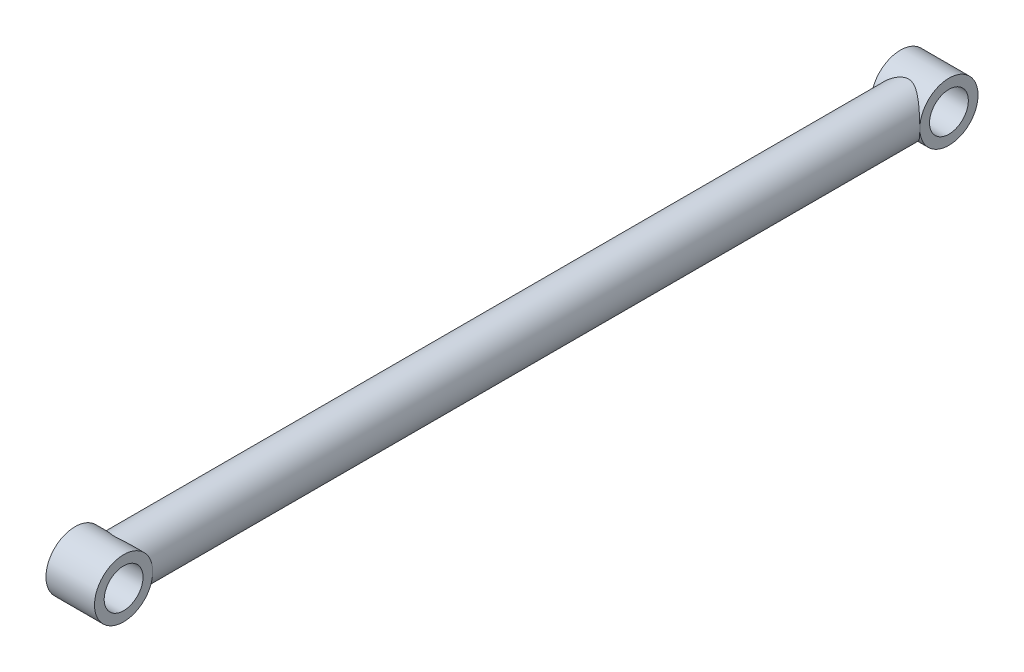
ISO-10303-21;
HEADER;
FILE_DESCRIPTION(('STEP AP214'),'2;1');
FILE_NAME('part.step','',(''),(''),'','','');
FILE_SCHEMA(('AUTOMOTIVE_DESIGN { 1 0 10303 214 1 1 1 1 }'));
ENDSEC;
DATA;
#1=APPLICATION_CONTEXT('core data for automotive mechanical design processes');
#2=APPLICATION_PROTOCOL_DEFINITION('international standard','automotive_design',2000,#1);
#3=PRODUCT_CONTEXT('',#1,'mechanical');
#4=PRODUCT('Part','Part','',(#3));
#5=PRODUCT_RELATED_PRODUCT_CATEGORY('part','',(#4));
#6=PRODUCT_DEFINITION_FORMATION('','',#4);
#7=PRODUCT_DEFINITION_CONTEXT('part definition',#1,'design');
#8=PRODUCT_DEFINITION('design','',#6,#7);
#9=PRODUCT_DEFINITION_SHAPE('','',#8);
#10=(LENGTH_UNIT() NAMED_UNIT(*) SI_UNIT(.MILLI.,.METRE.));
#11=(NAMED_UNIT(*) PLANE_ANGLE_UNIT() SI_UNIT($,.RADIAN.));
#12=(NAMED_UNIT(*) SI_UNIT($,.STERADIAN.) SOLID_ANGLE_UNIT());
#13=UNCERTAINTY_MEASURE_WITH_UNIT(LENGTH_MEASURE(1.E-05),#10,'distance_accuracy_value','');
#14=(GEOMETRIC_REPRESENTATION_CONTEXT(3) GLOBAL_UNCERTAINTY_ASSIGNED_CONTEXT((#13)) GLOBAL_UNIT_ASSIGNED_CONTEXT((#10,
#11,#12)) REPRESENTATION_CONTEXT('',''));
#15=CARTESIAN_POINT('',(0.,0.,0.));
#16=DIRECTION('',(0.,0.,1.));
#17=DIRECTION('',(1.,0.,0.));
#18=AXIS2_PLACEMENT_3D('',#15,#16,#17);
#19=CARTESIAN_POINT('',(0.,0.,170.));
#20=DIRECTION('',(0.,0.,-1.));
#21=DIRECTION('',(-1.,0.,0.));
#22=AXIS2_PLACEMENT_3D('',#19,#20,#21);
#23=CYLINDRICAL_SURFACE('',#22,5.);
#24=CARTESIAN_POINT('',(-5.,0.,164.));
#25=CARTESIAN_POINT('',(-5.0000064862677,-0.118803401095404,163.999993637204));
#26=CARTESIAN_POINT('',(-4.99576243276274,-0.237558182871218,164.003532436608));
#27=CARTESIAN_POINT('',(-4.97888342242901,-0.474087838067091,164.01758781878));
#28=CARTESIAN_POINT('',(-4.96624750352265,-0.591862597565707,164.028105201601));
#29=CARTESIAN_POINT('',(-4.93280067838579,-0.825474733693951,164.055890647865));
#30=CARTESIAN_POINT('',(-4.9119867768663,-0.941311384241479,164.073161184726));
#31=CARTESIAN_POINT('',(-4.86255145148515,-1.17018155731566,164.114066169517));
#32=CARTESIAN_POINT('',(-4.83392655878944,-1.28321381003105,164.137703444833));
#33=CARTESIAN_POINT('',(-4.73740362240781,-1.61550772291657,164.21712549774));
#34=CARTESIAN_POINT('',(-4.65860789353559,-1.82964493287682,164.281630481709));
#35=CARTESIAN_POINT('',(-4.47594785576945,-2.23973970904934,164.429432068903));
#36=CARTESIAN_POINT('',(-4.37207507698348,-2.4356911018925,164.512735020608));
#37=CARTESIAN_POINT('',(-4.17931765246547,-2.74874935510359,164.664796967453));
#38=CARTESIAN_POINT('',(-4.09605321766379,-2.87121824175386,164.729845481327));
#39=CARTESIAN_POINT('',(-3.92057491487891,-3.10654667374617,164.865043917853));
#40=CARTESIAN_POINT('',(-3.82836116355909,-3.21940634431805,164.935193773999));
#41=CARTESIAN_POINT('',(-3.63553308278676,-3.43568816068561,165.079330910766));
#42=CARTESIAN_POINT('',(-3.53489678957744,-3.53908406033976,165.153328021096));
#43=CARTESIAN_POINT('',(-3.3260070437939,-3.73607907111507,165.303506811469));
#44=CARTESIAN_POINT('',(-3.21775455132495,-3.8296794133862,165.379688215443));
#45=CARTESIAN_POINT('',(-2.99186847524312,-4.00872533168447,165.534090593809));
#46=CARTESIAN_POINT('',(-2.87409893732902,-4.09398918746845,165.612323305427));
#47=CARTESIAN_POINT('',(-2.63097870098597,-4.25431125048951,165.767590859531));
#48=CARTESIAN_POINT('',(-2.50562548412934,-4.32936604026973,165.844625293293));
#49=CARTESIAN_POINT('',(-2.24746866950543,-4.46882104937818,165.994988438694));
#50=CARTESIAN_POINT('',(-2.1146836425388,-4.53324636625594,166.068325587028));
#51=CARTESIAN_POINT('',(-1.84110422364289,-4.65107409789266,166.208445967709));
#52=CARTESIAN_POINT('',(-1.70031678782895,-4.7044859047621,166.275234758659));
#53=CARTESIAN_POINT('',(-1.39667622874441,-4.8038705578035,166.404163695034));
#54=CARTESIAN_POINT('',(-1.2329915636929,-4.8486776643058,166.465282103806));
#55=CARTESIAN_POINT('',(-0.89618081181772,-4.92202476595886,166.568128085754));
#56=CARTESIAN_POINT('',(-0.723078773763452,-4.95060424437363,166.609902678024));
#57=CARTESIAN_POINT('',(-0.457661896369328,-4.97982440219376,166.653115686237));
#58=CARTESIAN_POINT('',(-0.367618679010208,-4.98729261982801,166.6642863));
#59=CARTESIAN_POINT('',(-0.186635888055972,-4.99733565959028,166.679348465274));
#60=CARTESIAN_POINT('',(-0.095696399075085,-4.99991093928053,166.683240697421));
#61=CARTESIAN_POINT('',(0.0861953552894909,-5.00008454722765,166.683502917529));
#62=CARTESIAN_POINT('',(0.177147620700291,-4.99768286475912,166.679872889279));
#63=CARTESIAN_POINT('',(0.358199787378105,-4.98797701095386,166.665309542838));
#64=CARTESIAN_POINT('',(0.448299583463606,-4.9806722424497,166.65437533504));
#65=CARTESIAN_POINT('',(0.634290345987509,-4.9605577711742,166.624616752253));
#66=CARTESIAN_POINT('',(0.730044329719754,-4.94734291419499,166.605214847078));
#67=CARTESIAN_POINT('',(0.919072038911205,-4.91574053984291,166.559612529394));
#68=CARTESIAN_POINT('',(1.01234395824115,-4.89734936269664,166.533407307809));
#69=CARTESIAN_POINT('',(1.28826795172827,-4.83487145070514,166.446256557005));
#70=CARTESIAN_POINT('',(1.46664526370661,-4.78352415648849,166.376845736021));
#71=CARTESIAN_POINT('',(1.77568076874673,-4.67632227850058,166.239951281895));
#72=CARTESIAN_POINT('',(1.90862269999416,-4.62355194613135,166.174992042876));
#73=CARTESIAN_POINT('',(2.16730339944133,-4.50808681272014,166.039561687936));
#74=CARTESIAN_POINT('',(2.29303788433661,-4.44538619181529,165.969087352102));
#75=CARTESIAN_POINT('',(2.53766285158915,-4.31043075762213,165.825081209764));
#76=CARTESIAN_POINT('',(2.65654383781023,-4.23816312441516,165.751545393107));
#77=CARTESIAN_POINT('',(2.887435642852,-4.08435401417141,165.603472913388));
#78=CARTESIAN_POINT('',(2.99944783455585,-4.00281439970956,165.528936453981));
#79=CARTESIAN_POINT('',(3.22226109628925,-3.82600354374309,165.376579223159));
#80=CARTESIAN_POINT('',(3.33269201981384,-3.73023700414127,165.298790707347));
#81=CARTESIAN_POINT('',(3.54559939981482,-3.52848927170204,165.145535959127));
#82=CARTESIAN_POINT('',(3.64807467199061,-3.42250656330088,165.070070073477));
#83=CARTESIAN_POINT('',(3.84425294796646,-3.20056123189976,164.923183546337));
#84=CARTESIAN_POINT('',(3.93797365950208,-3.08461970676721,164.851754859816));
#85=CARTESIAN_POINT('',(4.11599426421232,-2.84274064052499,164.714338905396));
#86=CARTESIAN_POINT('',(4.20029381312781,-2.71680273442451,164.648351836362));
#87=CARTESIAN_POINT('',(4.39878554184215,-2.38827463214807,164.491466854075));
#88=CARTESIAN_POINT('',(4.50631929530223,-2.17932731194457,164.40501053214));
#89=CARTESIAN_POINT('',(4.6461382191431,-1.85137170360815,164.291596129459));
#90=CARTESIAN_POINT('',(4.68917312218693,-1.73959798407551,164.256495593987));
#91=CARTESIAN_POINT('',(4.76751793421715,-1.5117085668639,164.192357028335));
#92=CARTESIAN_POINT('',(4.80283171060455,-1.39559507719873,164.163315963388));
#93=CARTESIAN_POINT('',(4.86543453319275,-1.15874024023436,164.111694818951));
#94=CARTESIAN_POINT('',(4.89265476556203,-1.03796855116848,164.089170185509));
#95=CARTESIAN_POINT('',(4.93816722227971,-0.793680719841994,164.051442774801));
#96=CARTESIAN_POINT('',(4.95646386645159,-0.670165967971763,164.036236372888));
#97=CARTESIAN_POINT('',(4.98377697031546,-0.421443909131326,164.013517273965));
#98=CARTESIAN_POINT('',(4.99279601788868,-0.296237084023963,164.006002431483));
#99=CARTESIAN_POINT('',(5.00137053830483,-0.0452813606588042,163.99885833827));
#100=CARTESIAN_POINT('',(5.00092704086014,0.0804674771283417,163.999228229523));
#101=CARTESIAN_POINT('',(4.9912131909085,0.316217699577943,164.007320807918));
#102=CARTESIAN_POINT('',(4.98300958868131,0.426296149457778,164.014154882391));
#103=CARTESIAN_POINT('',(4.95942180024423,0.645178571447215,164.033776596911));
#104=CARTESIAN_POINT('',(4.94403538382096,0.753982136950611,164.046566086069));
#105=CARTESIAN_POINT('',(4.90632392627915,0.969508932578306,164.077846411027));
#106=CARTESIAN_POINT('',(4.88400108118508,1.07623280976892,164.096335442378));
#107=CARTESIAN_POINT('',(4.83274114539644,1.28701083316508,164.138670741227));
#108=CARTESIAN_POINT('',(4.80380153552006,1.39106394571239,164.162519049088));
#109=CARTESIAN_POINT('',(4.70677908129299,1.7010035720486,164.242190020335));
#110=CARTESIAN_POINT('',(4.62897463511254,1.9019731799027,164.305734510938));
#111=CARTESIAN_POINT('',(4.45119251532423,2.28736622034059,164.449291701797));
#112=CARTESIAN_POINT('',(4.3512066453561,2.47178350112437,164.529310488757));
#113=CARTESIAN_POINT('',(4.1624130336276,2.77431022087583,164.678035970102));
#114=CARTESIAN_POINT('',(4.0780788136314,2.89671891082119,164.74381246034));
#115=CARTESIAN_POINT('',(3.90043631108397,3.13182124456798,164.880412696568));
#116=CARTESIAN_POINT('',(3.80712768883633,3.24451452031801,164.951236633586));
#117=CARTESIAN_POINT('',(3.61204642318577,3.46039828484838,165.096670900892));
#118=CARTESIAN_POINT('',(3.51024916115615,3.56355916557856,165.171291981155));
#119=CARTESIAN_POINT('',(3.29899388009153,3.75997885952871,165.322615719837));
#120=CARTESIAN_POINT('',(3.18953694443029,3.85323906840844,165.399318082945));
#121=CARTESIAN_POINT('',(2.96121350414881,4.03144708201685,165.554592788302));
#122=CARTESIAN_POINT('',(2.84221365304655,4.11621624228696,165.633174029159));
#123=CARTESIAN_POINT('',(2.59654816531051,4.27543853436323,165.788939860809));
#124=CARTESIAN_POINT('',(2.46987979366079,4.34988795406826,165.866123940397));
#125=CARTESIAN_POINT('',(2.20902653418027,4.48797579821674,166.016477189005));
#126=CARTESIAN_POINT('',(2.07486275313431,4.5516427283941,166.089656586787));
#127=CARTESIAN_POINT('',(1.79841659242439,4.66777738062596,166.22904841427));
#128=CARTESIAN_POINT('',(1.65614180525616,4.72025536508446,166.295267199669));
#129=CARTESIAN_POINT('',(1.35146946258289,4.81674752553352,166.421491086304));
#130=CARTESIAN_POINT('',(1.18836978046231,4.85976816309607,166.480594639897));
#131=CARTESIAN_POINT('',(0.853057506761652,4.92964324178356,166.579129868936));
#132=CARTESIAN_POINT('',(0.68086885802008,4.95653805629937,166.618610630155));
#133=CARTESIAN_POINT('',(0.417267118823478,4.98335884043903,166.658388143927));
#134=CARTESIAN_POINT('',(0.327939885729427,4.99004397434119,166.668407002933));
#135=CARTESIAN_POINT('',(0.148522532584006,4.99859875462369,166.681253423056));
#136=CARTESIAN_POINT('',(0.0584324772193321,5.00046880529626,166.68408158793));
#137=CARTESIAN_POINT('',(-0.121644228189346,4.99933140644564,166.682367649082));
#138=CARTESIAN_POINT('',(-0.211630875727247,4.99632384110741,166.677825370354));
#139=CARTESIAN_POINT('',(-0.390705731690877,4.98551920595954,166.661633404506));
#140=CARTESIAN_POINT('',(-0.47979344453758,4.97771962684742,166.649979993715));
#141=CARTESIAN_POINT('',(-0.665670000297157,4.95646386284238,166.618601030407));
#142=CARTESIAN_POINT('',(-0.762277582327873,4.94249693749092,166.598152480986));
#143=CARTESIAN_POINT('',(-0.952897655384488,4.90931375512976,166.550437000639));
#144=CARTESIAN_POINT('',(-1.04690820177153,4.89009367595846,166.523165106317));
#145=CARTESIAN_POINT('',(-1.32490519247795,4.8250289352981,166.432849622302));
#146=CARTESIAN_POINT('',(-1.50447425917302,4.77182601328661,166.361379650538));
#147=CARTESIAN_POINT('',(-1.81560530153221,4.66101333620417,166.220942915864));
#148=CARTESIAN_POINT('',(-1.94948557461553,4.60651894445037,166.154442116726));
#149=CARTESIAN_POINT('',(-2.20989471783674,4.48741065580203,166.016097847012));
#150=CARTESIAN_POINT('',(-2.33641925480238,4.42279087534719,165.944251283));
#151=CARTESIAN_POINT('',(-2.58247503937633,4.28378589016394,165.797690769041));
#152=CARTESIAN_POINT('',(-2.70199665984658,4.2093876779387,165.722973095249));
#153=CARTESIAN_POINT('',(-2.93399936330049,4.05109347216154,165.572749153453));
#154=CARTESIAN_POINT('',(-3.04648185894273,3.96719939385693,165.497243047249));
#155=CARTESIAN_POINT('',(-3.26970299172238,3.78559728592267,165.343380537841));
#156=CARTESIAN_POINT('',(-3.38008420704462,3.68741297206348,165.265066438866));
#157=CARTESIAN_POINT('',(-3.59266286414684,3.48062708656682,165.111046523001));
#158=CARTESIAN_POINT('',(-3.69485901563594,3.37202387840549,165.035341118412));
#159=CARTESIAN_POINT('',(-3.89018127821449,3.14465963115808,164.88830854053));
#160=CARTESIAN_POINT('',(-3.98332637820856,3.02592088507476,164.816972322433));
#161=CARTESIAN_POINT('',(-4.15984718243074,2.77827797167412,164.680110195279));
#162=CARTESIAN_POINT('',(-4.24322187964866,2.64937275881195,164.614584885306));
#163=CARTESIAN_POINT('',(-4.43658392581481,2.3171577550576,164.461199242977));
#164=CARTESIAN_POINT('',(-4.54010823809405,2.10785901335221,164.377736073906));
#165=CARTESIAN_POINT('',(-4.67390583373133,1.78004652854708,164.268967142579));
#166=CARTESIAN_POINT('',(-4.71491832045553,1.66848545194822,164.235452843433));
#167=CARTESIAN_POINT('',(-4.78927419077672,1.44122911865495,164.174479197701));
#168=CARTESIAN_POINT('',(-4.82261863938527,1.32553443865751,164.147019010283));
#169=CARTESIAN_POINT('',(-4.90034346391482,1.01333234603968,164.082855108749));
#170=CARTESIAN_POINT('',(-4.93754678243695,0.813745597053287,164.05195986098));
#171=CARTESIAN_POINT('',(-4.98736819813601,0.409390797411419,164.010538835449));
#172=CARTESIAN_POINT('',(-4.99998882825426,0.20462328277229,164.000010959083));
#173=CARTESIAN_POINT('',(-5.,0.,164.));
#174=B_SPLINE_CURVE_WITH_KNOTS('',3,(#24,#25,#26,#27,#28,#29,#30,#31,#32,#33,#34,#35,#36,#37,
#38,#39,#40,#41,#42,#43,#44,#45,#46,#47,#48,#49,#50,#51,#52,#53,#54,#55,#56,#57,#58,#59,#60,#61,
#62,#63,#64,#65,#66,#67,#68,#69,#70,#71,#72,#73,#74,#75,#76,#77,#78,#79,#80,#81,#82,#83,#84,#85,
#86,#87,#88,#89,#90,#91,#92,#93,#94,#95,#96,#97,#98,#99,#100,#101,#102,#103,#104,#105,#106,#107,
#108,#109,#110,#111,#112,#113,#114,#115,#116,#117,#118,#119,#120,#121,#122,#123,#124,#125,#126,
#127,#128,#129,#130,#131,#132,#133,#134,#135,#136,#137,#138,#139,#140,#141,#142,#143,#144,#145,
#146,#147,#148,#149,#150,#151,#152,#153,#154,#155,#156,#157,#158,#159,#160,#161,#162,#163,#164,
#165,#166,#167,#168,#169,#170,#171,#172,#173),.UNSPECIFIED.,.T.,.F.,(4,2,2,2,2,2,2,2,2,2,2,2,2,
2,2,2,2,2,2,2,2,2,2,2,2,2,2,2,2,2,2,2,2,2,2,2,2,2,2,2,2,2,2,2,2,2,2,2,2,2,2,2,2,2,2,2,2,2,2,2,2,
2,2,2,2,2,2,2,2,2,2,2,2,2,4),(0.,0.356198531128417,0.712437905356866,1.06880787854775,
1.42533637270188,2.13333209783896,2.84156728725027,3.32622201622343,3.81087042808176,
4.29682459639559,4.78271761425371,5.27755036039958,5.77254834493269,6.26636031071475,
6.75974940543411,7.2993625527848,7.83765708456691,8.11040822806102,8.38313386402393,
8.65586008771503,8.92861953390791,9.2239270185622,9.51944381892723,10.1116379066241,
10.5823769120489,11.0533928323054,11.5250464324406,11.9966054526408,12.4928422896337,
12.9891528567513,13.4844367603639,13.979738756255,14.7274446962692,15.10150349884,
15.4753745093336,15.8523389140401,16.2291164194432,16.6057887984766,16.9824201883012,
17.3138076935884,17.6452981608743,17.9766837873554,18.3081957920452,18.9794342536,
19.6509211619365,20.1379627282135,20.6250227371036,21.1135480143902,21.6020043344423,
22.0992028034934,22.5965796576366,23.0926203414621,23.5882040850606,24.1228614856737,
24.6561746412,24.9262177314021,25.1962381470459,25.4662649741991,25.7364333195518,
26.0351569724179,26.3340985560113,26.9331443359532,27.4099325615983,27.8869988690867,
28.3647063284081,28.8423176087131,29.3434029116173,29.8445670506109,30.3446559675371,
30.844796382089,31.5852621624667,31.9553671316833,32.3254206660409,32.9389891607903,
33.5524944315665),.UNSPECIFIED.);
#175=CARTESIAN_POINT('',(-5.,0.,164.));
#176=VERTEX_POINT('',#175);
#177=CARTESIAN_POINT('',(5.00000000000002,0.,164.));
#178=VERTEX_POINT('',#177);
#179=EDGE_CURVE('E75',#176,#178,#174,.T.);
#180=ORIENTED_EDGE('',*,*,#179,.F.);
#181=EDGE_CURVE('E61',#178,#176,#174,.T.);
#182=ORIENTED_EDGE('',*,*,#181,.F.);
#183=EDGE_LOOP('',(#180,#182));
#184=FACE_BOUND('',#183,.T.);
#185=CARTESIAN_POINT('',(5.,0.,6.));
#186=CARTESIAN_POINT('',(5.00002798627288,-0.119348935079419,6.00002919850301));
#187=CARTESIAN_POINT('',(4.99572803553543,-0.23867958036178,5.99644020652463));
#188=CARTESIAN_POINT('',(4.97868412788821,-0.476234476230305,5.98224494804962));
#189=CARTESIAN_POINT('',(4.96594611312676,-0.594459446069387,5.97164361970086));
#190=CARTESIAN_POINT('',(4.93236700382239,-0.828002477996366,5.94374988935124));
#191=CARTESIAN_POINT('',(4.91158897146557,-0.943335902346165,5.9265095655111));
#192=CARTESIAN_POINT('',(4.86229105276058,-1.17120170011539,5.8857184515863));
#193=CARTESIAN_POINT('',(4.83377018032473,-1.28373371476774,5.86216685773619));
#194=CARTESIAN_POINT('',(4.76951835736753,-1.50496658686726,5.80930051949784));
#195=CARTESIAN_POINT('',(4.73380779812543,-1.61367728038003,5.78000208014341));
#196=CARTESIAN_POINT('',(4.65562143123109,-1.82705211318845,5.71614428529929));
#197=CARTESIAN_POINT('',(4.61314316805229,-1.93171476653797,5.68158302050031));
#198=CARTESIAN_POINT('',(4.47616272504167,-2.23926573906388,5.57073812162035));
#199=CARTESIAN_POINT('',(4.3721770693891,-2.43550744867541,5.48734511252619));
#200=CARTESIAN_POINT('',(4.17930372356553,-2.7487842906501,5.33519226752433));
#201=CARTESIAN_POINT('',(4.09603750264319,-2.87124496412886,5.2701422858056));
#202=CARTESIAN_POINT('',(3.92054441805434,-3.10658192431559,5.13493271106889));
#203=CARTESIAN_POINT('',(3.82831737859482,-3.2194580229123,5.06477301781555));
#204=CARTESIAN_POINT('',(3.63548337755196,-3.43574133365567,4.92063241630692));
#205=CARTESIAN_POINT('',(3.53485619448337,-3.53912436048791,4.84664246009394));
#206=CARTESIAN_POINT('',(3.32598578779926,-3.7360970997034,4.69647824059821));
#207=CARTESIAN_POINT('',(3.21774353082589,-3.82968805133515,4.62030425527637));
#208=CARTESIAN_POINT('',(2.99186761360954,-4.00872611376803,4.46590881347895));
#209=CARTESIAN_POINT('',(2.87409722305524,-4.0939904560112,4.3876755543847));
#210=CARTESIAN_POINT('',(2.6309750881559,-4.25431349476038,4.23240687859203));
#211=CARTESIAN_POINT('',(2.50562082230674,-4.32936876969041,4.15537187111191));
#212=CARTESIAN_POINT('',(2.24746373773334,-4.46882350281307,4.00500880900492));
#213=CARTESIAN_POINT('',(2.114679606144,-4.53324821588881,3.93167226471335));
#214=CARTESIAN_POINT('',(1.84110210714595,-4.65107489837774,3.7915530290794));
#215=CARTESIAN_POINT('',(1.70031569672374,-4.70448626106774,3.72476477842125));
#216=CARTESIAN_POINT('',(1.39667699983213,-4.80387030632006,3.59583663196801));
#217=CARTESIAN_POINT('',(1.23299315747397,-4.84867722860129,3.53471849082027));
#218=CARTESIAN_POINT('',(0.896182495864177,-4.92202448714337,3.43187232185616));
#219=CARTESIAN_POINT('',(0.723079629981996,-4.95060414994846,3.39009746162937));
#220=CARTESIAN_POINT('',(0.457661938224444,-4.97982439766832,3.34688432045088));
#221=CARTESIAN_POINT('',(0.367618763795172,-4.98729261281735,3.33571371048368));
#222=CARTESIAN_POINT('',(0.186636059098122,-4.99733565239978,3.32065154554476));
#223=CARTESIAN_POINT('',(0.095696613445123,-4.99991093439811,3.316759309933));
#224=CARTESIAN_POINT('',(-0.0861951407917185,-5.00008455170297,3.31649707573075));
#225=CARTESIAN_POINT('',(-0.177147449414514,-4.99768287160056,3.32012710042958));
#226=CARTESIAN_POINT('',(-0.358199702166334,-4.98797701786367,3.33469044681948));
#227=CARTESIAN_POINT('',(-0.448299541111552,-4.98067224704856,3.34562465813616));
#228=CARTESIAN_POINT('',(-0.634291003932044,-4.9605576999989,3.3753833530699));
#229=CARTESIAN_POINT('',(-0.730045633205449,-4.94734273423708,3.39478541722633));
#230=CARTESIAN_POINT('',(-0.919074596107933,-4.91574007429052,3.44038813776632));
#231=CARTESIAN_POINT('',(-1.0123471235597,-4.89734872024239,3.46659360333995));
#232=CARTESIAN_POINT('',(-1.28827037830915,-4.83487075242421,3.55374438737304));
#233=CARTESIAN_POINT('',(-1.46664643390008,-4.783523750858,3.62315478197574));
#234=CARTESIAN_POINT('',(-1.77567908944062,-4.67632286079959,3.76004797450957));
#235=CARTESIAN_POINT('',(-1.90861943875745,-4.62355324007214,3.82500636461011));
#236=CARTESIAN_POINT('',(-2.1672971701239,-4.50808975490199,3.96043493597843));
#237=CARTESIAN_POINT('',(-2.29303026764359,-4.44539006893123,4.03090833809998));
#238=CARTESIAN_POINT('',(-2.53765563195538,-4.31043506598059,4.1749143659975));
#239=CARTESIAN_POINT('',(-2.6565382300731,-4.23816669614868,4.24845107486114));
#240=CARTESIAN_POINT('',(-2.88743300391471,-4.08435593589021,4.39652533009788));
#241=CARTESIAN_POINT('',(-2.99944655755873,-4.00281541487259,4.47106267206462));
#242=CARTESIAN_POINT('',(-3.22225027568276,-3.82601212839693,4.62341337862811));
#243=CARTESIAN_POINT('',(-3.33267109721392,-3.73025514063295,4.70119455751783));
#244=CARTESIAN_POINT('',(-3.54556008678871,-3.52852821337353,4.85443541775559));
#245=CARTESIAN_POINT('',(-3.64802705005762,-3.42255673211236,4.92989474637107));
#246=CARTESIAN_POINT('',(-3.84421060857415,-3.2006128271596,5.07678427846323));
#247=CARTESIAN_POINT('',(-3.93794315555609,-3.08465940978153,5.14822172873355));
#248=CARTESIAN_POINT('',(-4.11598177032474,-2.84275936137359,5.28565131588156));
#249=CARTESIAN_POINT('',(-4.20028786473935,-2.71681275857424,5.35164346814102));
#250=CARTESIAN_POINT('',(-4.39889001810325,-2.38810144095985,5.50861571334714));
#251=CARTESIAN_POINT('',(-4.50650789937269,-2.17895977321482,5.59514105315609));
#252=CARTESIAN_POINT('',(-4.64632915436093,-1.85088623475908,5.70855943809661));
#253=CARTESIAN_POINT('',(-4.68931579975437,-1.73920687354843,5.74362100254321));
#254=CARTESIAN_POINT('',(-4.76757931871188,-1.51150608578613,5.80769343721714));
#255=CARTESIAN_POINT('',(-4.8028598770863,-1.39548676568957,5.83670719901046));
#256=CARTESIAN_POINT('',(-4.86104289099879,-1.17535732699399,5.88468396792441));
#257=CARTESIAN_POINT('',(-4.88496398649261,-1.07169341842585,5.90446771651074));
#258=CARTESIAN_POINT('',(-4.92625539477401,-0.862207885533472,5.93867484563281));
#259=CARTESIAN_POINT('',(-4.94362692805165,-0.756386667094952,5.95309922486268));
#260=CARTESIAN_POINT('',(-4.97164997323593,-0.542568390622355,5.97639011806746));
#261=CARTESIAN_POINT('',(-4.98225886411516,-0.434561874332823,5.9852213796444));
#262=CARTESIAN_POINT('',(-4.99644567156344,-0.217707897793812,5.99703818296618));
#263=CARTESIAN_POINT('',(-5.00001943921961,-0.108859979293944,6.00002027520211));
#264=CARTESIAN_POINT('',(-5.,0.,6.));
#265=B_SPLINE_CURVE_WITH_KNOTS('',3,(#185,#186,#187,#188,#189,#190,#191,#192,#193,#194,#195,
#196,#197,#198,#199,#200,#201,#202,#203,#204,#205,#206,#207,#208,#209,#210,#211,#212,#213,#214,
#215,#216,#217,#218,#219,#220,#221,#222,#223,#224,#225,#226,#227,#228,#229,#230,#231,#232,#233,
#234,#235,#236,#237,#238,#239,#240,#241,#242,#243,#244,#245,#246,#247,#248,#249,#250,#251,#252,
#253,#254,#255,#256,#257,#258,#259,#260,#261,#262,#263,#264),.UNSPECIFIED.,.F.,.F.,(4,2,2,2,2,2,
2,2,2,2,2,2,2,2,2,2,2,2,2,2,2,2,2,2,2,2,2,2,2,2,2,2,2,2,2,2,2,2,2,4),(0.,0.357886576578299,
0.715521394269878,1.07040616284639,1.42533614891328,1.77927332038449,2.13333920459453,
2.84213783886469,3.32683244474596,3.81153656126864,4.29744314238673,4.78328815440653,
5.27812448023868,5.77312624430843,6.26693455915681,6.76031994717008,7.29993047702809,
7.83822762424364,8.1109786393578,8.38370414677767,8.65643049857137,8.92919007358413,
9.2244995672027,9.52001838035353,10.112208453625,10.5829416913736,11.0539519263477,
11.52561142687,11.997176001593,12.4933658472267,12.9896307049052,13.4849706986806,
13.9803092931816,14.7286685065876,15.1023956024283,15.4759436005044,15.8002491052014,
16.124494146696,16.4507630235861,16.7772242576031),.UNSPECIFIED.);
#266=CARTESIAN_POINT('',(5.,0.,6.));
#267=VERTEX_POINT('',#266);
#268=CARTESIAN_POINT('',(-5.,0.,6.));
#269=VERTEX_POINT('',#268);
#270=EDGE_CURVE('E11',#267,#269,#265,.T.);
#271=ORIENTED_EDGE('',*,*,#270,.F.);
#272=CARTESIAN_POINT('',(-5.,0.,6.));
#273=CARTESIAN_POINT('',(-5.00002798627288,0.119348935079419,6.00002919850301));
#274=CARTESIAN_POINT('',(-4.99572803553543,0.23867958036178,5.99644020652463));
#275=CARTESIAN_POINT('',(-4.97868412788821,0.476234476230305,5.98224494804962));
#276=CARTESIAN_POINT('',(-4.96594611312676,0.594459446069387,5.97164361970086));
#277=CARTESIAN_POINT('',(-4.93236700382239,0.828002477996366,5.94374988935124));
#278=CARTESIAN_POINT('',(-4.91158897146557,0.943335902346166,5.9265095655111));
#279=CARTESIAN_POINT('',(-4.86229105276058,1.17120170011539,5.8857184515863));
#280=CARTESIAN_POINT('',(-4.83377018032473,1.28373371476774,5.86216685773619));
#281=CARTESIAN_POINT('',(-4.76951835736753,1.50496658686726,5.80930051949784));
#282=CARTESIAN_POINT('',(-4.73380779812543,1.61367728038003,5.78000208014341));
#283=CARTESIAN_POINT('',(-4.65562143123109,1.82705211318845,5.71614428529929));
#284=CARTESIAN_POINT('',(-4.61314316805229,1.93171476653797,5.68158302050031));
#285=CARTESIAN_POINT('',(-4.47616272504167,2.23926573906388,5.57073812162035));
#286=CARTESIAN_POINT('',(-4.3721770693891,2.43550744867541,5.48734511252619));
#287=CARTESIAN_POINT('',(-4.17930372356553,2.7487842906501,5.33519226752433));
#288=CARTESIAN_POINT('',(-4.09603750264319,2.87124496412886,5.2701422858056));
#289=CARTESIAN_POINT('',(-3.92054441805434,3.10658192431559,5.13493271106889));
#290=CARTESIAN_POINT('',(-3.82831737859482,3.2194580229123,5.06477301781555));
#291=CARTESIAN_POINT('',(-3.63548337755196,3.43574133365567,4.92063241630691));
#292=CARTESIAN_POINT('',(-3.53485619448337,3.53912436048791,4.84664246009394));
#293=CARTESIAN_POINT('',(-3.32598578779926,3.7360970997034,4.69647824059821));
#294=CARTESIAN_POINT('',(-3.21774353082589,3.82968805133515,4.62030425527637));
#295=CARTESIAN_POINT('',(-2.99186761360954,4.00872611376803,4.46590881347895));
#296=CARTESIAN_POINT('',(-2.87409722305524,4.0939904560112,4.3876755543847));
#297=CARTESIAN_POINT('',(-2.6309750881559,4.25431349476038,4.23240687859203));
#298=CARTESIAN_POINT('',(-2.50562082230674,4.32936876969041,4.15537187111191));
#299=CARTESIAN_POINT('',(-2.24746373773334,4.46882350281307,4.00500880900492));
#300=CARTESIAN_POINT('',(-2.114679606144,4.53324821588881,3.93167226471335));
#301=CARTESIAN_POINT('',(-1.84110210714595,4.65107489837774,3.7915530290794));
#302=CARTESIAN_POINT('',(-1.70031569672374,4.70448626106774,3.72476477842125));
#303=CARTESIAN_POINT('',(-1.39667699983213,4.80387030632006,3.59583663196801));
#304=CARTESIAN_POINT('',(-1.23299315747397,4.84867722860129,3.53471849082027));
#305=CARTESIAN_POINT('',(-0.896182495864177,4.92202448714337,3.43187232185616));
#306=CARTESIAN_POINT('',(-0.723079629981996,4.95060414994845,3.39009746162936));
#307=CARTESIAN_POINT('',(-0.457661938224445,4.97982439766832,3.34688432045088));
#308=CARTESIAN_POINT('',(-0.367618763795173,4.98729261281735,3.33571371048368));
#309=CARTESIAN_POINT('',(-0.186636059098122,4.99733565239978,3.32065154554476));
#310=CARTESIAN_POINT('',(-0.0956966134451239,4.99991093439811,3.316759309933));
#311=CARTESIAN_POINT('',(0.0861951407917178,5.00008455170297,3.31649707573075));
#312=CARTESIAN_POINT('',(0.177147449414514,4.99768287160056,3.32012710042958));
#313=CARTESIAN_POINT('',(0.358199702166334,4.98797701786367,3.33469044681948));
#314=CARTESIAN_POINT('',(0.448299541111552,4.98067224704856,3.34562465813616));
#315=CARTESIAN_POINT('',(0.634291003932044,4.9605576999989,3.3753833530699));
#316=CARTESIAN_POINT('',(0.730045633205449,4.94734273423708,3.39478541722633));
#317=CARTESIAN_POINT('',(0.919074596107933,4.91574007429052,3.44038813776632));
#318=CARTESIAN_POINT('',(1.0123471235597,4.89734872024239,3.46659360333995));
#319=CARTESIAN_POINT('',(1.28827037830915,4.83487075242421,3.55374438737304));
#320=CARTESIAN_POINT('',(1.46664643390008,4.783523750858,3.62315478197574));
#321=CARTESIAN_POINT('',(1.77567908944062,4.67632286079959,3.76004797450956));
#322=CARTESIAN_POINT('',(1.90861943875745,4.62355324007214,3.82500636461011));
#323=CARTESIAN_POINT('',(2.1672971701239,4.50808975490199,3.96043493597843));
#324=CARTESIAN_POINT('',(2.29303026764359,4.44539006893123,4.03090833809998));
#325=CARTESIAN_POINT('',(2.53765563195538,4.31043506598059,4.1749143659975));
#326=CARTESIAN_POINT('',(2.6565382300731,4.23816669614868,4.24845107486114));
#327=CARTESIAN_POINT('',(2.88743300391471,4.08435593589021,4.39652533009788));
#328=CARTESIAN_POINT('',(2.99944655755873,4.00281541487259,4.47106267206462));
#329=CARTESIAN_POINT('',(3.22225027568276,3.82601212839693,4.62341337862811));
#330=CARTESIAN_POINT('',(3.33267109721392,3.73025514063295,4.70119455751783));
#331=CARTESIAN_POINT('',(3.54556008678871,3.52852821337353,4.85443541775559));
#332=CARTESIAN_POINT('',(3.64802705005762,3.42255673211236,4.92989474637106));
#333=CARTESIAN_POINT('',(3.84421060857415,3.2006128271596,5.07678427846323));
#334=CARTESIAN_POINT('',(3.93794315555608,3.08465940978153,5.14822172873355));
#335=CARTESIAN_POINT('',(4.11598177032474,2.84275936137359,5.28565131588156));
#336=CARTESIAN_POINT('',(4.20028786473935,2.71681275857424,5.35164346814102));
#337=CARTESIAN_POINT('',(4.39889001810325,2.38810144095985,5.50861571334714));
#338=CARTESIAN_POINT('',(4.50650789937269,2.17895977321482,5.59514105315609));
#339=CARTESIAN_POINT('',(4.64632915436093,1.85088623475909,5.7085594380966));
#340=CARTESIAN_POINT('',(4.68931579975437,1.73920687354843,5.74362100254321));
#341=CARTESIAN_POINT('',(4.76757931871188,1.51150608578613,5.80769343721714));
#342=CARTESIAN_POINT('',(4.8028598770863,1.39548676568957,5.83670719901046));
#343=CARTESIAN_POINT('',(4.86104289099879,1.17535732699399,5.88468396792441));
#344=CARTESIAN_POINT('',(4.88496398649261,1.07169341842586,5.90446771651074));
#345=CARTESIAN_POINT('',(4.92625539477401,0.862207885533474,5.93867484563281));
#346=CARTESIAN_POINT('',(4.94362692805165,0.756386667094954,5.95309922486268));
#347=CARTESIAN_POINT('',(4.97164997323593,0.542568390622357,5.97639011806746));
#348=CARTESIAN_POINT('',(4.98225886411516,0.434561874332825,5.9852213796444));
#349=CARTESIAN_POINT('',(4.99644567156344,0.217707897793812,5.99703818296618));
#350=CARTESIAN_POINT('',(5.00001943921961,0.108859979293944,6.0000202752021));
#351=CARTESIAN_POINT('',(5.,0.,6.));
#352=B_SPLINE_CURVE_WITH_KNOTS('',3,(#272,#273,#274,#275,#276,#277,#278,#279,#280,#281,#282,
#283,#284,#285,#286,#287,#288,#289,#290,#291,#292,#293,#294,#295,#296,#297,#298,#299,#300,#301,
#302,#303,#304,#305,#306,#307,#308,#309,#310,#311,#312,#313,#314,#315,#316,#317,#318,#319,#320,
#321,#322,#323,#324,#325,#326,#327,#328,#329,#330,#331,#332,#333,#334,#335,#336,#337,#338,#339,
#340,#341,#342,#343,#344,#345,#346,#347,#348,#349,#350,#351),.UNSPECIFIED.,.F.,.F.,(4,2,2,2,2,2,
2,2,2,2,2,2,2,2,2,2,2,2,2,2,2,2,2,2,2,2,2,2,2,2,2,2,2,2,2,2,2,2,2,4),(0.,0.357886576578299,
0.715521394269878,1.07040616284639,1.42533614891328,1.77927332038448,2.13333920459453,
2.84213783886469,3.32683244474596,3.81153656126864,4.29744314238673,4.78328815440653,
5.27812448023868,5.77312624430843,6.26693455915681,6.76031994717008,7.29993047702809,
7.83822762424363,8.11097863935779,8.38370414677767,8.65643049857137,8.92919007358413,
9.2244995672027,9.52001838035353,10.112208453625,10.5829416913736,11.0539519263477,
11.52561142687,11.997176001593,12.4933658472267,12.9896307049052,13.4849706986806,
13.9803092931816,14.7286685065876,15.1023956024283,15.4759436005045,15.8002491052014,
16.124494146696,16.4507630235861,16.7772242576031),.UNSPECIFIED.);
#353=EDGE_CURVE('E49',#269,#267,#352,.T.);
#354=ORIENTED_EDGE('',*,*,#353,.F.);
#355=EDGE_LOOP('',(#271,#354));
#356=FACE_BOUND('',#355,.T.);
#357=ADVANCED_FACE('F39',(#184,#356),#23,.T.);
#358=CARTESIAN_POINT('',(5.,0.,170.));
#359=DIRECTION('',(-1.,0.,0.));
#360=DIRECTION('',(0.,0.,1.));
#361=AXIS2_PLACEMENT_3D('',#358,#359,#360);
#362=CYLINDRICAL_SURFACE('',#361,5.99999999999999);
#363=CARTESIAN_POINT('',(-5.,0.,170.));
#364=DIRECTION('',(1.,0.,0.));
#365=DIRECTION('',(0.,0.,-1.));
#366=AXIS2_PLACEMENT_3D('',#363,#364,#365);
#367=CIRCLE('',#366,5.99999999999999);
#368=EDGE_CURVE('E80',#176,#176,#367,.T.);
#369=ORIENTED_EDGE('',*,*,#368,.T.);
#370=ORIENTED_EDGE('',*,*,#179,.T.);
#371=CARTESIAN_POINT('',(5.,0.,170.));
#372=DIRECTION('',(1.,0.,0.));
#373=DIRECTION('',(0.,0.,-1.));
#374=AXIS2_PLACEMENT_3D('',#371,#372,#373);
#375=CIRCLE('',#374,5.99999999999999);
#376=EDGE_CURVE('E85',#178,#178,#375,.T.);
#377=ORIENTED_EDGE('',*,*,#376,.F.);
#378=ORIENTED_EDGE('',*,*,#181,.T.);
#379=EDGE_LOOP('',(#369,#370,#377,#378));
#380=FACE_BOUND('',#379,.T.);
#381=ADVANCED_FACE('F104',(#380),#362,.T.);
#382=CARTESIAN_POINT('',(5.,0.,170.));
#383=DIRECTION('',(1.,0.,0.));
#384=DIRECTION('',(0.,0.,-1.));
#385=AXIS2_PLACEMENT_3D('',#382,#383,#384);
#386=PLANE('',#385);
#387=CARTESIAN_POINT('',(5.,0.,170.));
#388=DIRECTION('',(1.,0.,0.));
#389=DIRECTION('',(0.,0.,-1.));
#390=AXIS2_PLACEMENT_3D('',#387,#388,#389);
#391=CIRCLE('',#390,3.99999999999999);
#392=CARTESIAN_POINT('',(5.,0.,166.));
#393=VERTEX_POINT('',#392);
#394=EDGE_CURVE('E129',#393,#393,#391,.T.);
#395=ORIENTED_EDGE('',*,*,#394,.F.);
#396=EDGE_LOOP('',(#395));
#397=FACE_BOUND('',#396,.T.);
#398=ORIENTED_EDGE('',*,*,#376,.T.);
#399=EDGE_LOOP('',(#398));
#400=FACE_BOUND('',#399,.T.);
#401=ADVANCED_FACE('F108',(#397,#400),#386,.T.);
#402=CARTESIAN_POINT('',(-5.,0.,170.));
#403=DIRECTION('',(1.,0.,0.));
#404=DIRECTION('',(0.,0.,-1.));
#405=AXIS2_PLACEMENT_3D('',#402,#403,#404);
#406=PLANE('',#405);
#407=CARTESIAN_POINT('',(-5.,0.,170.));
#408=DIRECTION('',(1.,0.,0.));
#409=DIRECTION('',(0.,0.,-1.));
#410=AXIS2_PLACEMENT_3D('',#407,#408,#409);
#411=CIRCLE('',#410,3.99999999999999);
#412=CARTESIAN_POINT('',(-5.,0.,166.));
#413=VERTEX_POINT('',#412);
#414=EDGE_CURVE('E43',#413,#413,#411,.T.);
#415=ORIENTED_EDGE('',*,*,#414,.T.);
#416=EDGE_LOOP('',(#415));
#417=FACE_BOUND('',#416,.T.);
#418=ORIENTED_EDGE('',*,*,#368,.F.);
#419=EDGE_LOOP('',(#418));
#420=FACE_BOUND('',#419,.T.);
#421=ADVANCED_FACE('F110',(#417,#420),#406,.F.);
#422=CARTESIAN_POINT('',(5.,0.,0.));
#423=DIRECTION('',(-1.,0.,0.));
#424=DIRECTION('',(0.,0.,1.));
#425=AXIS2_PLACEMENT_3D('',#422,#423,#424);
#426=CYLINDRICAL_SURFACE('',#425,6.);
#427=CARTESIAN_POINT('',(5.,0.,0.));
#428=DIRECTION('',(1.,0.,0.));
#429=DIRECTION('',(0.,0.,-1.));
#430=AXIS2_PLACEMENT_3D('',#427,#428,#429);
#431=CIRCLE('',#430,6.);
#432=EDGE_CURVE('E71',#267,#267,#431,.T.);
#433=ORIENTED_EDGE('',*,*,#432,.F.);
#434=ORIENTED_EDGE('',*,*,#270,.T.);
#435=CARTESIAN_POINT('',(-5.,0.,0.));
#436=DIRECTION('',(1.,0.,0.));
#437=DIRECTION('',(0.,0.,-1.));
#438=AXIS2_PLACEMENT_3D('',#435,#436,#437);
#439=CIRCLE('',#438,6.);
#440=EDGE_CURVE('E73',#269,#269,#439,.T.);
#441=ORIENTED_EDGE('',*,*,#440,.T.);
#442=ORIENTED_EDGE('',*,*,#353,.T.);
#443=EDGE_LOOP('',(#433,#434,#441,#442));
#444=FACE_BOUND('',#443,.T.);
#445=ADVANCED_FACE('F70',(#444),#426,.T.);
#446=CARTESIAN_POINT('',(5.,0.,0.));
#447=DIRECTION('',(1.,0.,0.));
#448=DIRECTION('',(0.,0.,-1.));
#449=AXIS2_PLACEMENT_3D('',#446,#447,#448);
#450=PLANE('',#449);
#451=CARTESIAN_POINT('',(5.,0.,0.));
#452=DIRECTION('',(1.,0.,0.));
#453=DIRECTION('',(0.,0.,-1.));
#454=AXIS2_PLACEMENT_3D('',#451,#452,#453);
#455=CIRCLE('',#454,3.99994428602524);
#456=CARTESIAN_POINT('',(5.,0.,-3.99994428602524));
#457=VERTEX_POINT('',#456);
#458=EDGE_CURVE('E89',#457,#457,#455,.T.);
#459=ORIENTED_EDGE('',*,*,#458,.F.);
#460=EDGE_LOOP('',(#459));
#461=FACE_BOUND('',#460,.T.);
#462=ORIENTED_EDGE('',*,*,#432,.T.);
#463=EDGE_LOOP('',(#462));
#464=FACE_BOUND('',#463,.T.);
#465=ADVANCED_FACE('F78',(#461,#464),#450,.T.);
#466=CARTESIAN_POINT('',(-5.,0.,0.));
#467=DIRECTION('',(1.,0.,0.));
#468=DIRECTION('',(0.,0.,-1.));
#469=AXIS2_PLACEMENT_3D('',#466,#467,#468);
#470=PLANE('',#469);
#471=CARTESIAN_POINT('',(-5.,0.,0.));
#472=DIRECTION('',(1.,0.,0.));
#473=DIRECTION('',(0.,0.,-1.));
#474=AXIS2_PLACEMENT_3D('',#471,#472,#473);
#475=CIRCLE('',#474,3.99994428602524);
#476=CARTESIAN_POINT('',(-5.,0.,-3.99994428602524));
#477=VERTEX_POINT('',#476);
#478=EDGE_CURVE('E126',#477,#477,#475,.T.);
#479=ORIENTED_EDGE('',*,*,#478,.T.);
#480=EDGE_LOOP('',(#479));
#481=FACE_BOUND('',#480,.T.);
#482=ORIENTED_EDGE('',*,*,#440,.F.);
#483=EDGE_LOOP('',(#482));
#484=FACE_BOUND('',#483,.T.);
#485=ADVANCED_FACE('F119',(#481,#484),#470,.F.);
#486=CARTESIAN_POINT('',(-7.,0.,0.));
#487=DIRECTION('',(1.,0.,0.));
#488=DIRECTION('',(0.,0.,-1.));
#489=AXIS2_PLACEMENT_3D('',#486,#487,#488);
#490=CYLINDRICAL_SURFACE('',#489,3.99994428602524);
#491=ORIENTED_EDGE('',*,*,#458,.T.);
#492=EDGE_LOOP('',(#491));
#493=FACE_BOUND('',#492,.T.);
#494=ORIENTED_EDGE('',*,*,#478,.F.);
#495=EDGE_LOOP('',(#494));
#496=FACE_BOUND('',#495,.T.);
#497=ADVANCED_FACE('F142',(#493,#496),#490,.F.);
#498=CARTESIAN_POINT('',(-7.,0.,170.));
#499=DIRECTION('',(1.,0.,0.));
#500=DIRECTION('',(0.,0.,-1.));
#501=AXIS2_PLACEMENT_3D('',#498,#499,#500);
#502=CYLINDRICAL_SURFACE('',#501,3.99999999999999);
#503=ORIENTED_EDGE('',*,*,#394,.T.);
#504=EDGE_LOOP('',(#503));
#505=FACE_BOUND('',#504,.T.);
#506=ORIENTED_EDGE('',*,*,#414,.F.);
#507=EDGE_LOOP('',(#506));
#508=FACE_BOUND('',#507,.T.);
#509=ADVANCED_FACE('F195',(#505,#508),#502,.F.);
#510=CLOSED_SHELL('',(#357,#381,#401,#421,#445,#465,#485,#497,#509));
#511=MANIFOLD_SOLID_BREP('B2',#510);
#512=ADVANCED_BREP_SHAPE_REPRESENTATION('',(#18,#511),#14);
#513=SHAPE_DEFINITION_REPRESENTATION(#9,#512);
ENDSEC;
END-ISO-10303-21;
